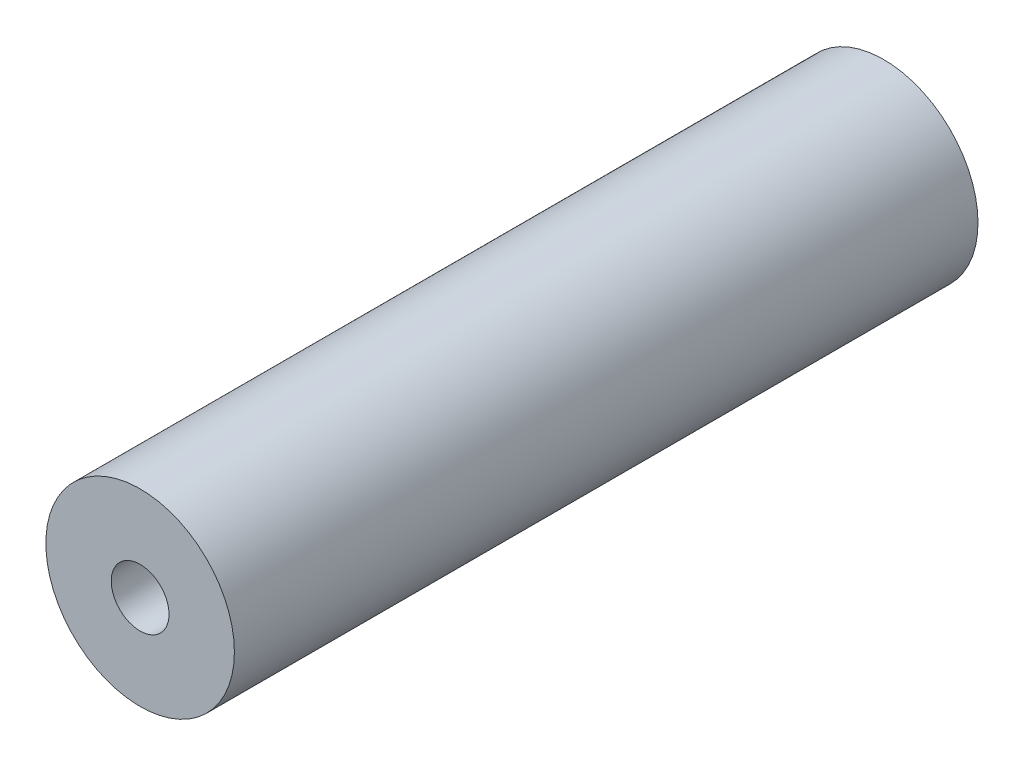
ISO-10303-21;
HEADER;
FILE_DESCRIPTION(('STEP AP214'),'2;1');
FILE_NAME('part.step','',(''),(''),'','','');
FILE_SCHEMA(('AUTOMOTIVE_DESIGN { 1 0 10303 214 1 1 1 1 }'));
ENDSEC;
DATA;
#1=APPLICATION_CONTEXT('core data for automotive mechanical design processes');
#2=APPLICATION_PROTOCOL_DEFINITION('international standard','automotive_design',2000,#1);
#3=PRODUCT_CONTEXT('',#1,'mechanical');
#4=PRODUCT('Part','Part','',(#3));
#5=PRODUCT_RELATED_PRODUCT_CATEGORY('part','',(#4));
#6=PRODUCT_DEFINITION_FORMATION('','',#4);
#7=PRODUCT_DEFINITION_CONTEXT('part definition',#1,'design');
#8=PRODUCT_DEFINITION('design','',#6,#7);
#9=PRODUCT_DEFINITION_SHAPE('','',#8);
#10=(LENGTH_UNIT() NAMED_UNIT(*) SI_UNIT(.MILLI.,.METRE.));
#11=(NAMED_UNIT(*) PLANE_ANGLE_UNIT() SI_UNIT($,.RADIAN.));
#12=(NAMED_UNIT(*) SI_UNIT($,.STERADIAN.) SOLID_ANGLE_UNIT());
#13=UNCERTAINTY_MEASURE_WITH_UNIT(LENGTH_MEASURE(1.E-05),#10,'distance_accuracy_value','');
#14=(GEOMETRIC_REPRESENTATION_CONTEXT(3) GLOBAL_UNCERTAINTY_ASSIGNED_CONTEXT((#13)) GLOBAL_UNIT_ASSIGNED_CONTEXT((#10,
#11,#12)) REPRESENTATION_CONTEXT('',''));
#15=CARTESIAN_POINT('',(0.,0.,0.));
#16=DIRECTION('',(0.,0.,1.));
#17=DIRECTION('',(1.,0.,0.));
#18=AXIS2_PLACEMENT_3D('',#15,#16,#17);
#19=CARTESIAN_POINT('',(0.,0.,63.1));
#20=DIRECTION('',(0.,0.,-1.));
#21=DIRECTION('',(-1.,0.,0.));
#22=AXIS2_PLACEMENT_3D('',#19,#20,#21);
#23=CYLINDRICAL_SURFACE('',#22,8.);
#24=CARTESIAN_POINT('',(0.,0.,63.1));
#25=DIRECTION('',(0.,0.,1.));
#26=DIRECTION('',(1.,0.,0.));
#27=AXIS2_PLACEMENT_3D('',#24,#25,#26);
#28=CIRCLE('',#27,8.);
#29=CARTESIAN_POINT('',(8.,0.,63.1));
#30=VERTEX_POINT('',#29);
#31=EDGE_CURVE('E10',#30,#30,#28,.T.);
#32=ORIENTED_EDGE('',*,*,#31,.F.);
#33=EDGE_LOOP('',(#32));
#34=FACE_BOUND('',#33,.T.);
#35=CARTESIAN_POINT('',(0.,0.,0.));
#36=DIRECTION('',(0.,0.,1.));
#37=DIRECTION('',(1.,0.,0.));
#38=AXIS2_PLACEMENT_3D('',#35,#36,#37);
#39=CIRCLE('',#38,8.);
#40=CARTESIAN_POINT('',(8.,0.,0.));
#41=VERTEX_POINT('',#40);
#42=EDGE_CURVE('E40',#41,#41,#39,.T.);
#43=ORIENTED_EDGE('',*,*,#42,.T.);
#44=EDGE_LOOP('',(#43));
#45=FACE_BOUND('',#44,.T.);
#46=ADVANCED_FACE('F37',(#34,#45),#23,.T.);
#47=CARTESIAN_POINT('',(0.,0.,63.1));
#48=DIRECTION('',(0.,0.,1.));
#49=DIRECTION('',(1.,0.,0.));
#50=AXIS2_PLACEMENT_3D('',#47,#48,#49);
#51=PLANE('',#50);
#52=CARTESIAN_POINT('',(0.,0.,63.1));
#53=DIRECTION('',(0.,0.,1.));
#54=DIRECTION('',(1.,0.,0.));
#55=AXIS2_PLACEMENT_3D('',#52,#53,#54);
#56=CIRCLE('',#55,2.45);
#57=CARTESIAN_POINT('',(2.45,0.,63.1));
#58=VERTEX_POINT('',#57);
#59=EDGE_CURVE('E51',#58,#58,#56,.T.);
#60=ORIENTED_EDGE('',*,*,#59,.F.);
#61=EDGE_LOOP('',(#60));
#62=FACE_BOUND('',#61,.T.);
#63=ORIENTED_EDGE('',*,*,#31,.T.);
#64=EDGE_LOOP('',(#63));
#65=FACE_BOUND('',#64,.T.);
#66=ADVANCED_FACE('F80',(#62,#65),#51,.T.);
#67=CARTESIAN_POINT('',(0.,0.,0.));
#68=DIRECTION('',(0.,0.,1.));
#69=DIRECTION('',(1.,0.,0.));
#70=AXIS2_PLACEMENT_3D('',#67,#68,#69);
#71=PLANE('',#70);
#72=CARTESIAN_POINT('',(0.,0.,0.));
#73=DIRECTION('',(0.,0.,-1.));
#74=DIRECTION('',(-1.,0.,0.));
#75=AXIS2_PLACEMENT_3D('',#72,#73,#74);
#76=CIRCLE('',#75,2.45);
#77=CARTESIAN_POINT('',(-2.45,0.,0.));
#78=VERTEX_POINT('',#77);
#79=EDGE_CURVE('E59',#78,#78,#76,.T.);
#80=ORIENTED_EDGE('',*,*,#79,.F.);
#81=EDGE_LOOP('',(#80));
#82=FACE_BOUND('',#81,.T.);
#83=ORIENTED_EDGE('',*,*,#42,.F.);
#84=EDGE_LOOP('',(#83));
#85=FACE_BOUND('',#84,.T.);
#86=ADVANCED_FACE('F76',(#82,#85),#71,.F.);
#87=CARTESIAN_POINT('',(0.,0.,53.1));
#88=DIRECTION('',(0.,0.,1.));
#89=DIRECTION('',(1.,0.,0.));
#90=AXIS2_PLACEMENT_3D('',#87,#88,#89);
#91=CYLINDRICAL_SURFACE('',#90,2.45);
#92=CARTESIAN_POINT('',(0.,0.,53.1));
#93=DIRECTION('',(0.,0.,1.));
#94=DIRECTION('',(1.,0.,0.));
#95=AXIS2_PLACEMENT_3D('',#92,#93,#94);
#96=CIRCLE('',#95,2.45);
#97=CARTESIAN_POINT('',(2.45,0.,53.1));
#98=VERTEX_POINT('',#97);
#99=EDGE_CURVE('E49',#98,#98,#96,.T.);
#100=ORIENTED_EDGE('',*,*,#99,.F.);
#101=EDGE_LOOP('',(#100));
#102=FACE_BOUND('',#101,.T.);
#103=ORIENTED_EDGE('',*,*,#59,.T.);
#104=EDGE_LOOP('',(#103));
#105=FACE_BOUND('',#104,.T.);
#106=ADVANCED_FACE('F79',(#102,#105),#91,.F.);
#107=CARTESIAN_POINT('',(0.,0.,53.1));
#108=DIRECTION('',(0.,0.,1.));
#109=DIRECTION('',(1.,0.,0.));
#110=AXIS2_PLACEMENT_3D('',#107,#108,#109);
#111=PLANE('',#110);
#112=ORIENTED_EDGE('',*,*,#99,.T.);
#113=EDGE_LOOP('',(#112));
#114=FACE_BOUND('',#113,.T.);
#115=ADVANCED_FACE('F72',(#114),#111,.T.);
#116=CARTESIAN_POINT('',(0.,0.,10.));
#117=DIRECTION('',(0.,0.,-1.));
#118=DIRECTION('',(-1.,0.,0.));
#119=AXIS2_PLACEMENT_3D('',#116,#117,#118);
#120=CYLINDRICAL_SURFACE('',#119,2.45);
#121=CARTESIAN_POINT('',(0.,0.,10.));
#122=DIRECTION('',(0.,0.,-1.));
#123=DIRECTION('',(-1.,0.,0.));
#124=AXIS2_PLACEMENT_3D('',#121,#122,#123);
#125=CIRCLE('',#124,2.45);
#126=CARTESIAN_POINT('',(-2.45,0.,10.));
#127=VERTEX_POINT('',#126);
#128=EDGE_CURVE('E55',#127,#127,#125,.T.);
#129=ORIENTED_EDGE('',*,*,#128,.F.);
#130=EDGE_LOOP('',(#129));
#131=FACE_BOUND('',#130,.T.);
#132=ORIENTED_EDGE('',*,*,#79,.T.);
#133=EDGE_LOOP('',(#132));
#134=FACE_BOUND('',#133,.T.);
#135=ADVANCED_FACE('F69',(#131,#134),#120,.F.);
#136=CARTESIAN_POINT('',(0.,0.,10.));
#137=DIRECTION('',(0.,0.,-1.));
#138=DIRECTION('',(-1.,0.,0.));
#139=AXIS2_PLACEMENT_3D('',#136,#137,#138);
#140=PLANE('',#139);
#141=ORIENTED_EDGE('',*,*,#128,.T.);
#142=EDGE_LOOP('',(#141));
#143=FACE_BOUND('',#142,.T.);
#144=ADVANCED_FACE('F67',(#143),#140,.T.);
#145=CLOSED_SHELL('',(#46,#66,#86,#106,#115,#135,#144));
#146=MANIFOLD_SOLID_BREP('B2',#145);
#147=ADVANCED_BREP_SHAPE_REPRESENTATION('',(#18,#146),#14);
#148=SHAPE_DEFINITION_REPRESENTATION(#9,#147);
ENDSEC;
END-ISO-10303-21;
